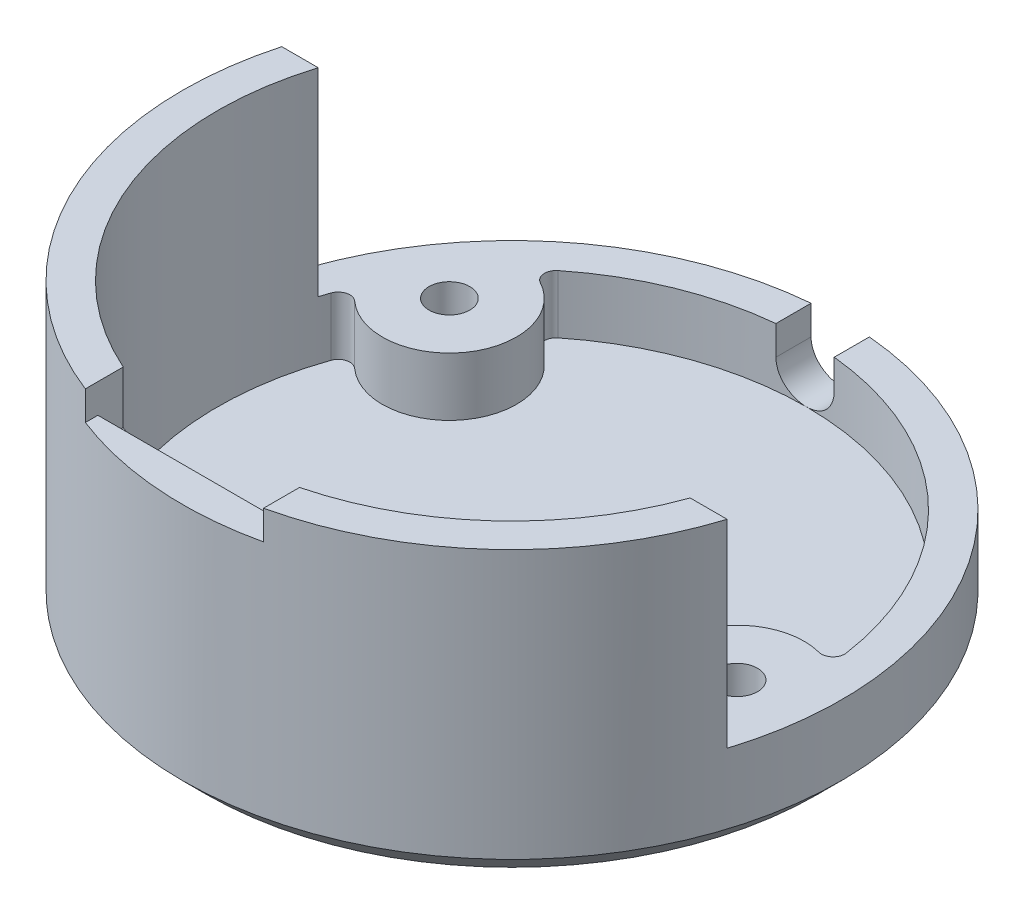
ISO-10303-21;
HEADER;
FILE_DESCRIPTION(('STEP AP214'),'2;1');
FILE_NAME('part.step','',(''),(''),'','','');
FILE_SCHEMA(('AUTOMOTIVE_DESIGN { 1 0 10303 214 1 1 1 1 }'));
ENDSEC;
DATA;
#1=APPLICATION_CONTEXT('core data for automotive mechanical design processes');
#2=APPLICATION_PROTOCOL_DEFINITION('international standard','automotive_design',2000,#1);
#3=PRODUCT_CONTEXT('',#1,'mechanical');
#4=PRODUCT('Part','Part','',(#3));
#5=PRODUCT_RELATED_PRODUCT_CATEGORY('part','',(#4));
#6=PRODUCT_DEFINITION_FORMATION('','',#4);
#7=PRODUCT_DEFINITION_CONTEXT('part definition',#1,'design');
#8=PRODUCT_DEFINITION('design','',#6,#7);
#9=PRODUCT_DEFINITION_SHAPE('','',#8);
#10=(LENGTH_UNIT() NAMED_UNIT(*) SI_UNIT(.MILLI.,.METRE.));
#11=(NAMED_UNIT(*) PLANE_ANGLE_UNIT() SI_UNIT($,.RADIAN.));
#12=(NAMED_UNIT(*) SI_UNIT($,.STERADIAN.) SOLID_ANGLE_UNIT());
#13=UNCERTAINTY_MEASURE_WITH_UNIT(LENGTH_MEASURE(1.E-05),#10,'distance_accuracy_value','');
#14=(GEOMETRIC_REPRESENTATION_CONTEXT(3) GLOBAL_UNCERTAINTY_ASSIGNED_CONTEXT((#13)) GLOBAL_UNIT_ASSIGNED_CONTEXT((#10,
#11,#12)) REPRESENTATION_CONTEXT('',''));
#15=CARTESIAN_POINT('',(0.,0.,0.));
#16=DIRECTION('',(0.,0.,1.));
#17=DIRECTION('',(1.,0.,0.));
#18=AXIS2_PLACEMENT_3D('',#15,#16,#17);
#19=CARTESIAN_POINT('',(0.,25.,0.));
#20=DIRECTION('',(0.,-1.,0.));
#21=DIRECTION('',(0.,0.,-1.));
#22=AXIS2_PLACEMENT_3D('',#19,#20,#21);
#23=CYLINDRICAL_SURFACE('',#22,25.25);
#24=CARTESIAN_POINT('',(0.,3.,0.));
#25=DIRECTION('',(0.,1.,0.));
#26=DIRECTION('',(0.,0.,1.));
#27=AXIS2_PLACEMENT_3D('',#24,#25,#26);
#28=CIRCLE('',#27,25.25);
#29=CARTESIAN_POINT('',(24.9803549939332,3.,-3.68026688938102));
#30=VERTEX_POINT('',#29);
#31=CARTESIAN_POINT('',(0.,3.,-25.25));
#32=VERTEX_POINT('',#31);
#33=EDGE_CURVE('E438',#30,#32,#28,.T.);
#34=ORIENTED_EDGE('',*,*,#33,.F.);
#35=DIRECTION('',(0.,-1.,0.));
#36=VECTOR('',#35,1.);
#37=CARTESIAN_POINT('',(24.9803549939332,25.,-3.68026688938102));
#38=LINE('',#37,#36);
#39=CARTESIAN_POINT('',(24.9803549939332,8.,-3.68026688938102));
#40=VERTEX_POINT('',#39);
#41=EDGE_CURVE('E375',#30,#40,#38,.F.);
#42=ORIENTED_EDGE('',*,*,#41,.T.);
#43=CARTESIAN_POINT('',(0.,8.,0.));
#44=DIRECTION('',(0.,-1.,0.));
#45=DIRECTION('',(0.,0.,-1.));
#46=AXIS2_PLACEMENT_3D('',#43,#44,#45);
#47=CIRCLE('',#46,25.25);
#48=CARTESIAN_POINT('',(2.5,8.,-25.1259328185045));
#49=VERTEX_POINT('',#48);
#50=EDGE_CURVE('E368',#49,#40,#47,.T.);
#51=ORIENTED_EDGE('',*,*,#50,.F.);
#52=DIRECTION('',(0.,-1.,0.));
#53=VECTOR('',#52,1.);
#54=CARTESIAN_POINT('',(2.49999999999999,25.,-25.1259328185045));
#55=LINE('',#54,#53);
#56=CARTESIAN_POINT('',(2.5,5.50000000000001,-25.1259328185045));
#57=VERTEX_POINT('',#56);
#58=EDGE_CURVE('E261',#57,#49,#55,.F.);
#59=ORIENTED_EDGE('',*,*,#58,.F.);
#60=CARTESIAN_POINT('',(0.,3.,-25.25));
#61=CARTESIAN_POINT('',(0.0701343196591282,2.99999306358478,-25.2500028305778));
#62=CARTESIAN_POINT('',(0.140265216695683,3.00295125432429,-25.2497078523953));
#63=CARTESIAN_POINT('',(0.28002189584099,3.01474418410962,-25.2485431940326));
#64=CARTESIAN_POINT('',(0.349647710913022,3.02357853610596,-25.2476735517042));
#65=CARTESIAN_POINT('',(0.487839193340102,3.0470588590707,-25.2453815722682));
#66=CARTESIAN_POINT('',(0.55640581115655,3.06169926232422,-25.2439597646865));
#67=CARTESIAN_POINT('',(0.692039109357974,3.09667030151849,-25.2406060478505));
#68=CARTESIAN_POINT('',(0.75910580235763,3.11700088958415,-25.238674142888));
#69=CARTESIAN_POINT('',(0.957399344983616,3.18635483372977,-25.232187775016));
#70=CARTESIAN_POINT('',(1.08578800052794,3.24375205073939,-25.2269414475106));
#71=CARTESIAN_POINT('',(1.33102535137235,3.37914694330917,-25.2151938494993));
#72=CARTESIAN_POINT('',(1.44787520992667,3.45714253937766,-25.2086927056903));
#73=CARTESIAN_POINT('',(1.66722062865698,3.63182460171821,-25.1951382803473));
#74=CARTESIAN_POINT('',(1.76967184646884,3.72856671434156,-25.1880833931481));
#75=CARTESIAN_POINT('',(1.95692252113277,3.9378924623258,-25.1742288495955));
#76=CARTESIAN_POINT('',(2.04171855501907,4.05047916253822,-25.1674292429445));
#77=CARTESIAN_POINT('',(2.19141651110233,4.28858723406225,-25.1548378724426));
#78=CARTESIAN_POINT('',(2.25627221690991,4.41413776648851,-25.1490484631821));
#79=CARTESIAN_POINT('',(2.36392987898948,4.6743882934218,-25.1391582315141));
#80=CARTESIAN_POINT('',(2.40674536949778,4.80908261533953,-25.1350563731436));
#81=CARTESIAN_POINT('',(2.45854901571322,5.0371565517034,-25.1300311487282));
#82=CARTESIAN_POINT('',(2.47408162673295,5.129089698999,-25.1285018799704));
#83=CARTESIAN_POINT('',(2.49480688701037,5.3140019424494,-25.1264495889556));
#84=CARTESIAN_POINT('',(2.50001315030004,5.406979498725,-25.1259252418626));
#85=CARTESIAN_POINT('',(2.5,5.50000000000001,-25.1259328185045));
#86=B_SPLINE_CURVE_WITH_KNOTS('',3,(#60,#61,#62,#63,#64,#65,#66,#67,#68,#69,#70,#71,#72,#73,#74,
#75,#76,#77,#78,#79,#80,#81,#82,#83,#84,#85),.UNSPECIFIED.,.F.,.F.,(4,2,2,2,2,2,2,2,2,2,2,2,4),
(0.,0.210333857785383,0.420653862726252,0.630772667034372,0.84088970353442,1.26091836444184,
1.68090463791503,2.10215722475029,2.52349140763364,2.94579489513256,3.36783874842554,
3.64703838499197,3.92586968552176),.UNSPECIFIED.);
#87=EDGE_CURVE('E275',#32,#57,#86,.T.);
#88=ORIENTED_EDGE('',*,*,#87,.F.);
#89=EDGE_LOOP('',(#34,#42,#51,#59,#88));
#90=FACE_BOUND('',#89,.T.);
#91=ADVANCED_FACE('F35',(#90),#23,.F.);
#92=DIRECTION('',(0.,1.,0.));
#93=VECTOR('',#92,1.);
#94=CARTESIAN_POINT('',(-10.25,22.5,23.0759615184286));
#95=LINE('',#94,#93);
#96=CARTESIAN_POINT('',(-10.25,20.5,23.0759615184286));
#97=VERTEX_POINT('',#96);
#98=CARTESIAN_POINT('',(-10.25,25.,23.0759615184286));
#99=VERTEX_POINT('',#98);
#100=EDGE_CURVE('E399',#97,#99,#95,.T.);
#101=ORIENTED_EDGE('',*,*,#100,.F.);
#102=CARTESIAN_POINT('',(0.,20.5,0.));
#103=DIRECTION('',(0.,1.,0.));
#104=DIRECTION('',(0.,0.,1.));
#105=AXIS2_PLACEMENT_3D('',#102,#103,#104);
#106=CIRCLE('',#105,25.25);
#107=CARTESIAN_POINT('',(0.,20.5,25.25));
#108=VERTEX_POINT('',#107);
#109=EDGE_CURVE('E39',#97,#108,#106,.T.);
#110=ORIENTED_EDGE('',*,*,#109,.T.);
#111=CARTESIAN_POINT('',(6.25,20.5,24.4642596454501));
#112=VERTEX_POINT('',#111);
#113=EDGE_CURVE('E11',#108,#112,#106,.T.);
#114=ORIENTED_EDGE('',*,*,#113,.T.);
#115=DIRECTION('',(0.,-1.,0.));
#116=VECTOR('',#115,1.);
#117=CARTESIAN_POINT('',(6.25,25.,24.4642596454501));
#118=LINE('',#117,#116);
#119=CARTESIAN_POINT('',(6.25,25.,24.4642596454501));
#120=VERTEX_POINT('',#119);
#121=EDGE_CURVE('E454',#120,#112,#118,.T.);
#122=ORIENTED_EDGE('',*,*,#121,.F.);
#123=CARTESIAN_POINT('',(0.,25.,0.));
#124=DIRECTION('',(0.,1.,0.));
#125=DIRECTION('',(0.,0.,1.));
#126=AXIS2_PLACEMENT_3D('',#123,#124,#125);
#127=CIRCLE('',#126,25.25);
#128=CARTESIAN_POINT('',(23.776301226221,25.,8.5));
#129=VERTEX_POINT('',#128);
#130=EDGE_CURVE('E441',#120,#129,#127,.T.);
#131=ORIENTED_EDGE('',*,*,#130,.T.);
#132=DIRECTION('',(0.,-1.,0.));
#133=VECTOR('',#132,1.);
#134=CARTESIAN_POINT('',(23.776301226221,25.,8.5));
#135=LINE('',#134,#133);
#136=CARTESIAN_POINT('',(23.776301226221,8.,8.5));
#137=VERTEX_POINT('',#136);
#138=EDGE_CURVE('E451',#137,#129,#135,.F.);
#139=ORIENTED_EDGE('',*,*,#138,.F.);
#140=CARTESIAN_POINT('',(0.,8.,0.));
#141=DIRECTION('',(0.,-1.,0.));
#142=DIRECTION('',(0.,0.,-1.));
#143=AXIS2_PLACEMENT_3D('',#140,#141,#142);
#144=CIRCLE('',#143,25.25);
#145=CARTESIAN_POINT('',(23.1195228059531,8.,10.1513627274872));
#146=VERTEX_POINT('',#145);
#147=EDGE_CURVE('E231',#137,#146,#144,.T.);
#148=ORIENTED_EDGE('',*,*,#147,.T.);
#149=DIRECTION('',(0.,-1.,0.));
#150=VECTOR('',#149,1.);
#151=CARTESIAN_POINT('',(23.1195228059531,25.,10.1513627274872));
#152=LINE('',#151,#150);
#153=CARTESIAN_POINT('',(23.1195228059531,3.,10.1513627274872));
#154=VERTEX_POINT('',#153);
#155=EDGE_CURVE('E470',#146,#154,#152,.T.);
#156=ORIENTED_EDGE('',*,*,#155,.T.);
#157=CARTESIAN_POINT('',(-23.838066942802,3.,-8.32520656983911));
#158=VERTEX_POINT('',#157);
#159=EDGE_CURVE('E442',#158,#154,#28,.T.);
#160=ORIENTED_EDGE('',*,*,#159,.F.);
#161=DIRECTION('',(0.,-1.,0.));
#162=VECTOR('',#161,1.);
#163=CARTESIAN_POINT('',(-23.838066942802,25.,-8.32520656983911));
#164=LINE('',#163,#162);
#165=CARTESIAN_POINT('',(-23.838066942802,8.,-8.32520656983911));
#166=VERTEX_POINT('',#165);
#167=EDGE_CURVE('E467',#158,#166,#164,.F.);
#168=ORIENTED_EDGE('',*,*,#167,.T.);
#169=CARTESIAN_POINT('',(-24.1104230572589,8.,-7.5));
#170=VERTEX_POINT('',#169);
#171=EDGE_CURVE('E367',#170,#166,#47,.T.);
#172=ORIENTED_EDGE('',*,*,#171,.F.);
#173=DIRECTION('',(0.,-1.,0.));
#174=VECTOR('',#173,1.);
#175=CARTESIAN_POINT('',(-24.1104230572589,25.,-7.5));
#176=LINE('',#175,#174);
#177=CARTESIAN_POINT('',(-24.1104230572589,25.,-7.5));
#178=VERTEX_POINT('',#177);
#179=EDGE_CURVE('E448',#178,#170,#176,.T.);
#180=ORIENTED_EDGE('',*,*,#179,.F.);
#181=EDGE_CURVE('E402',#178,#99,#127,.T.);
#182=ORIENTED_EDGE('',*,*,#181,.T.);
#183=EDGE_LOOP('',(#101,#110,#114,#122,#131,#139,#148,#156,#160,#168,#172,#180,#182));
#184=FACE_BOUND('',#183,.T.);
#185=ADVANCED_FACE('F339',(#184),#23,.F.);
#186=CARTESIAN_POINT('',(-15.7744607948879,8.,-19.7162087286208));
#187=VERTEX_POINT('',#186);
#188=CARTESIAN_POINT('',(-2.5,8.,-25.1259328185045));
#189=VERTEX_POINT('',#188);
#190=EDGE_CURVE('E359',#187,#189,#47,.T.);
#191=ORIENTED_EDGE('',*,*,#190,.F.);
#192=DIRECTION('',(0.,-1.,0.));
#193=VECTOR('',#192,1.);
#194=CARTESIAN_POINT('',(-15.7744607948879,25.,-19.7162087286209));
#195=LINE('',#194,#193);
#196=CARTESIAN_POINT('',(-15.7744607948879,3.,-19.7162087286208));
#197=VERTEX_POINT('',#196);
#198=EDGE_CURVE('E362',#187,#197,#195,.T.);
#199=ORIENTED_EDGE('',*,*,#198,.T.);
#200=EDGE_CURVE('E439',#32,#197,#28,.T.);
#201=ORIENTED_EDGE('',*,*,#200,.F.);
#202=CARTESIAN_POINT('',(-2.5,5.50000000000001,-25.1259328185045));
#203=CARTESIAN_POINT('',(-2.500006938468,5.42986653421026,-25.1259299323597));
#204=CARTESIAN_POINT('',(-2.4970488177389,5.35973649578316,-25.1262264005817));
#205=CARTESIAN_POINT('',(-2.48525618164105,5.21998158178091,-25.1273967215484));
#206=CARTESIAN_POINT('',(-2.47642205515371,5.15035667308388,-25.1282705360836));
#207=CARTESIAN_POINT('',(-2.4529423762165,5.01216717363184,-25.1305731266628));
#208=CARTESIAN_POINT('',(-2.43830240219161,4.94360163051897,-25.1320013699681));
#209=CARTESIAN_POINT('',(-2.40333242913165,4.80797049411069,-25.1353694799374));
#210=CARTESIAN_POINT('',(-2.38300247753148,4.74090488831598,-25.1373093423362));
#211=CARTESIAN_POINT('',(-2.31365084439657,4.54261477023227,-25.1438205308779));
#212=CARTESIAN_POINT('',(-2.2562556689679,4.41422841205633,-25.1490846804533));
#213=CARTESIAN_POINT('',(-2.12086554390219,4.16899483324265,-25.160862744428));
#214=CARTESIAN_POINT('',(-2.04287265501975,4.05214645986148,-25.1673765337859));
#215=CARTESIAN_POINT('',(-1.86819330921961,3.83279926558977,-25.1809458114164));
#216=CARTESIAN_POINT('',(-1.77145059949086,3.73034526719056,-25.1880028902555));
#217=CARTESIAN_POINT('',(-1.56212252140025,3.54308925651299,-25.2018501581695));
#218=CARTESIAN_POINT('',(-1.44953410001798,3.4582906537547,-25.208640295489));
#219=CARTESIAN_POINT('',(-1.21142455405267,3.30859002727512,-25.2212050250508));
#220=CARTESIAN_POINT('',(-1.08587456823887,3.24373374315931,-25.2269772699273));
#221=CARTESIAN_POINT('',(-0.8256251663262,3.13607483274152,-25.2368332171791));
#222=CARTESIAN_POINT('',(-0.690931414899495,3.09325869091226,-25.2409179540692));
#223=CARTESIAN_POINT('',(-0.462855672552283,3.04145318207209,-25.2459210955878));
#224=CARTESIAN_POINT('',(-0.370919998305977,3.02591972907533,-25.2474432398742));
#225=CARTESIAN_POINT('',(-0.186002830708624,3.00519337903663,-25.2494857434618));
#226=CARTESIAN_POINT('',(-0.0930228787671035,2.99998685361483,-25.2500074230396));
#227=CARTESIAN_POINT('',(0.,3.,-25.25));
#228=B_SPLINE_CURVE_WITH_KNOTS('',3,(#202,#203,#204,#205,#206,#207,#208,#209,#210,#211,#212,
#213,#214,#215,#216,#217,#218,#219,#220,#221,#222,#223,#224,#225,#226,#227),.UNSPECIFIED.,.F.,
.F.,(4,2,2,2,2,2,2,2,2,2,2,2,4),(0.,0.210331284577824,0.420648650553219,0.630764425273714,
0.840878448401325,1.26090047238821,1.68088049003108,2.10214059278194,2.52348197183612,
2.94578265042625,3.36782405500383,3.64703123459165,3.92586970044969),.UNSPECIFIED.);
#229=CARTESIAN_POINT('',(-2.5,5.50000000000001,-25.1259328185045));
#230=VERTEX_POINT('',#229);
#231=EDGE_CURVE('E266',#230,#32,#228,.T.);
#232=ORIENTED_EDGE('',*,*,#231,.F.);
#233=DIRECTION('',(0.,-1.,0.));
#234=VECTOR('',#233,1.);
#235=CARTESIAN_POINT('',(-2.49999999999999,25.,-25.1259328185045));
#236=LINE('',#235,#234);
#237=EDGE_CURVE('E254',#189,#230,#236,.T.);
#238=ORIENTED_EDGE('',*,*,#237,.F.);
#239=EDGE_LOOP('',(#191,#199,#201,#232,#238));
#240=FACE_BOUND('',#239,.T.);
#241=ADVANCED_FACE('F281',(#240),#23,.F.);
#242=CARTESIAN_POINT('',(0.,8.,0.));
#243=DIRECTION('',(0.,-1.,0.));
#244=DIRECTION('',(0.,0.,-1.));
#245=AXIS2_PLACEMENT_3D('',#242,#243,#244);
#246=PLANE('',#245);
#247=ORIENTED_EDGE('',*,*,#50,.T.);
#248=CARTESIAN_POINT('',(23.9910340040745,8.,-3.53451374524712));
#249=DIRECTION('',(0.,-1.,0.));
#250=DIRECTION('',(0.,0.,-1.));
#251=AXIS2_PLACEMENT_3D('',#248,#249,#250);
#252=CIRCLE('',#251,1.);
#253=CARTESIAN_POINT('',(23.7403775769491,8.,-2.56643763484013));
#254=VERTEX_POINT('',#253);
#255=EDGE_CURVE('E388',#40,#254,#252,.T.);
#256=ORIENTED_EDGE('',*,*,#255,.T.);
#257=CARTESIAN_POINT('',(22.2991031209778,8.,3.));
#258=DIRECTION('',(0.,-1.,0.));
#259=DIRECTION('',(0.,0.,-1.));
#260=AXIS2_PLACEMENT_3D('',#257,#258,#259);
#261=CIRCLE('',#260,5.75);
#262=CARTESIAN_POINT('',(22.2180025819422,8.,8.74942803264534));
#263=VERTEX_POINT('',#262);
#264=EDGE_CURVE('E224',#263,#254,#261,.T.);
#265=ORIENTED_EDGE('',*,*,#264,.F.);
#266=CARTESIAN_POINT('',(22.2038981403708,8.,9.74932856006193));
#267=DIRECTION('',(0.,-1.,0.));
#268=DIRECTION('',(0.,0.,-1.));
#269=AXIS2_PLACEMENT_3D('',#266,#267,#268);
#270=CIRCLE('',#269,1.);
#271=EDGE_CURVE('E385',#263,#146,#270,.T.);
#272=ORIENTED_EDGE('',*,*,#271,.T.);
#273=ORIENTED_EDGE('',*,*,#147,.F.);
#274=DIRECTION('',(1.,0.,0.));
#275=VECTOR('',#274,1.);
#276=CARTESIAN_POINT('',(28.25,8.,8.5));
#277=LINE('',#276,#275);
#278=CARTESIAN_POINT('',(26.9409075570961,8.,8.5));
#279=VERTEX_POINT('',#278);
#280=EDGE_CURVE('E422',#137,#279,#277,.T.);
#281=ORIENTED_EDGE('',*,*,#280,.T.);
#282=CARTESIAN_POINT('',(0.,8.,0.));
#283=DIRECTION('',(0.,-1.,0.));
#284=DIRECTION('',(0.,0.,-1.));
#285=AXIS2_PLACEMENT_3D('',#282,#283,#284);
#286=CIRCLE('',#285,28.25);
#287=CARTESIAN_POINT('',(2.5,8.,-28.1391631005615));
#288=VERTEX_POINT('',#287);
#289=EDGE_CURVE('E426',#288,#279,#286,.T.);
#290=ORIENTED_EDGE('',*,*,#289,.F.);
#291=DIRECTION('',(0.,0.,1.));
#292=VECTOR('',#291,1.);
#293=CARTESIAN_POINT('',(2.5,8.,0.));
#294=LINE('',#293,#292);
#295=EDGE_CURVE('E458',#288,#49,#294,.T.);
#296=ORIENTED_EDGE('',*,*,#295,.T.);
#297=EDGE_LOOP('',(#247,#256,#265,#272,#273,#281,#290,#296));
#298=FACE_BOUND('',#297,.T.);
#299=CARTESIAN_POINT('',(22.2991031209778,8.,3.));
#300=DIRECTION('',(0.,-1.,0.));
#301=DIRECTION('',(0.,0.,-1.));
#302=AXIS2_PLACEMENT_3D('',#299,#300,#301);
#303=CIRCLE('',#302,1.75);
#304=CARTESIAN_POINT('',(22.2991031209778,8.,1.25));
#305=VERTEX_POINT('',#304);
#306=EDGE_CURVE('E223',#305,#305,#303,.T.);
#307=ORIENTED_EDGE('',*,*,#306,.T.);
#308=EDGE_LOOP('',(#307));
#309=FACE_BOUND('',#308,.T.);
#310=ADVANCED_FACE('F348',(#298,#309),#246,.F.);
#311=CARTESIAN_POINT('',(0.,25.,0.));
#312=DIRECTION('',(0.,1.,0.));
#313=DIRECTION('',(0.,0.,1.));
#314=AXIS2_PLACEMENT_3D('',#311,#312,#313);
#315=PLANE('',#314);
#316=DIRECTION('',(0.,0.,1.));
#317=VECTOR('',#316,1.);
#318=CARTESIAN_POINT('',(-10.25,25.,28.25));
#319=LINE('',#318,#317);
#320=CARTESIAN_POINT('',(-10.25,25.,26.3248931621764));
#321=VERTEX_POINT('',#320);
#322=EDGE_CURVE('E305',#99,#321,#319,.T.);
#323=ORIENTED_EDGE('',*,*,#322,.F.);
#324=ORIENTED_EDGE('',*,*,#181,.F.);
#325=DIRECTION('',(1.,0.,0.));
#326=VECTOR('',#325,1.);
#327=CARTESIAN_POINT('',(0.,25.,-7.5));
#328=LINE('',#327,#326);
#329=CARTESIAN_POINT('',(-27.2362350555285,25.,-7.5));
#330=VERTEX_POINT('',#329);
#331=EDGE_CURVE('E419',#330,#178,#328,.T.);
#332=ORIENTED_EDGE('',*,*,#331,.F.);
#333=CARTESIAN_POINT('',(0.,25.,0.));
#334=DIRECTION('',(0.,1.,0.));
#335=DIRECTION('',(0.,0.,1.));
#336=AXIS2_PLACEMENT_3D('',#333,#334,#335);
#337=CIRCLE('',#336,28.25);
#338=EDGE_CURVE('E445',#330,#321,#337,.T.);
#339=ORIENTED_EDGE('',*,*,#338,.T.);
#340=EDGE_LOOP('',(#323,#324,#332,#339));
#341=FACE_BOUND('',#340,.T.);
#342=ADVANCED_FACE('F313',(#341),#315,.T.);
#343=CARTESIAN_POINT('',(0.,25.,0.));
#344=DIRECTION('',(0.,-1.,0.));
#345=DIRECTION('',(0.,0.,-1.));
#346=AXIS2_PLACEMENT_3D('',#343,#344,#345);
#347=CYLINDRICAL_SURFACE('',#346,28.25);
#348=CARTESIAN_POINT('',(0.,2.00000000000001,0.));
#349=DIRECTION('',(0.,1.,0.));
#350=DIRECTION('',(0.,0.,1.));
#351=AXIS2_PLACEMENT_3D('',#348,#349,#350);
#352=CIRCLE('',#351,28.25);
#353=CARTESIAN_POINT('',(0.,2.00000000000001,28.25));
#354=VERTEX_POINT('',#353);
#355=EDGE_CURVE('E392',#354,#354,#352,.T.);
#356=ORIENTED_EDGE('',*,*,#355,.T.);
#357=EDGE_LOOP('',(#356));
#358=FACE_BOUND('',#357,.T.);
#359=DIRECTION('',(0.,-1.,0.));
#360=VECTOR('',#359,1.);
#361=CARTESIAN_POINT('',(-2.49999999999999,25.,-28.1391631005615));
#362=LINE('',#361,#360);
#363=CARTESIAN_POINT('',(-2.5,8.,-28.1391631005615));
#364=VERTEX_POINT('',#363);
#365=CARTESIAN_POINT('',(-2.5,5.50000000000001,-28.1391631005615));
#366=VERTEX_POINT('',#365);
#367=EDGE_CURVE('E258',#364,#366,#362,.T.);
#368=ORIENTED_EDGE('',*,*,#367,.T.);
#369=CARTESIAN_POINT('',(-2.5,5.50000000000001,-28.1391631005615));
#370=CARTESIAN_POINT('',(-2.50000689646736,5.42983158110518,-28.1391605268283));
#371=CARTESIAN_POINT('',(-2.49704587192604,5.35966654391296,-28.1394255065767));
#372=CARTESIAN_POINT('',(-2.48524137720348,5.21984116334117,-28.1404715595615));
#373=CARTESIAN_POINT('',(-2.47639827411585,5.15018078874045,-28.1412526005912));
#374=CARTESIAN_POINT('',(-2.45289315868328,5.01191350397061,-28.1433108780643));
#375=CARTESIAN_POINT('',(-2.43823617740451,4.94330573610088,-28.1445876854739));
#376=CARTESIAN_POINT('',(-2.40322433236625,4.80759053233639,-28.1475988072722));
#377=CARTESIAN_POINT('',(-2.38286952025361,4.74048308284823,-28.1493331175141));
#378=CARTESIAN_POINT('',(-2.31343065689666,4.54206866329107,-28.1551546160368));
#379=CARTESIAN_POINT('',(-2.25596048312088,4.41360122201702,-28.1598614614813));
#380=CARTESIAN_POINT('',(-2.12038895426501,4.16822475735298,-28.1703929814974));
#381=CARTESIAN_POINT('',(-2.04229042388618,4.05131415446113,-28.1762175029926));
#382=CARTESIAN_POINT('',(-1.86742315108781,3.83193436072547,-28.1883470718142));
#383=CARTESIAN_POINT('',(-1.77060888408628,3.72950145949167,-28.1946532676788));
#384=CARTESIAN_POINT('',(-1.56114861456425,3.54230970783483,-28.2070257141034));
#385=CARTESIAN_POINT('',(-1.44850020583893,3.45755354849495,-28.2130919280151));
#386=CARTESIAN_POINT('',(-1.21035195004412,3.30800371872389,-28.2243114954236));
#387=CARTESIAN_POINT('',(-1.08483169484369,3.24324242268324,-28.2294633627956));
#388=CARTESIAN_POINT('',(-0.824653394847859,3.13573315708137,-28.2382607519674));
#389=CARTESIAN_POINT('',(-0.689996082701349,3.0929834248926,-28.2419063943769));
#390=CARTESIAN_POINT('',(-0.415733392258923,3.03081288112124,-28.2472727686186));
#391=CARTESIAN_POINT('',(-0.276141907560928,3.01133121946507,-28.2489985204855));
#392=CARTESIAN_POINT('',(0.00434295763610671,2.99606171299833,-28.2503477175985));
#393=CARTESIAN_POINT('',(0.145236343056956,3.0002739577987,-28.2499711548935));
#394=CARTESIAN_POINT('',(0.423905114124957,3.03222383756093,-28.2471622070468));
#395=CARTESIAN_POINT('',(0.561688146800701,3.05989535359237,-28.2447355999325));
#396=CARTESIAN_POINT('',(0.830645714380134,3.1378753287869,-28.2381060993052));
#397=CARTESIAN_POINT('',(0.961820211596336,3.18818391702957,-28.2339031956633));
#398=CARTESIAN_POINT('',(1.21405015200019,3.31008439379139,-28.2241838091613));
#399=CARTESIAN_POINT('',(1.33509105117874,3.38170622269389,-28.2186654806045));
#400=CARTESIAN_POINT('',(1.56345295311568,3.54417514192329,-28.2069354702832));
#401=CARTESIAN_POINT('',(1.67077426591069,3.63502179768234,-28.2007238041927));
#402=CARTESIAN_POINT('',(1.86902949889513,3.83371928673604,-28.188280350554));
#403=CARTESIAN_POINT('',(1.95990822078429,3.94162519764428,-28.1820485641906));
#404=CARTESIAN_POINT('',(2.12229830427058,4.17123263663078,-28.1702858142741));
#405=CARTESIAN_POINT('',(2.19380371956517,4.29293838410872,-28.1647550661691));
#406=CARTESIAN_POINT('',(2.31541333150734,4.5467464493002,-28.1550190954106));
#407=CARTESIAN_POINT('',(2.3655015913039,4.67885642270672,-28.1508148604443));
#408=CARTESIAN_POINT('',(2.44269466413333,4.94955729805081,-28.1442226534277));
#409=CARTESIAN_POINT('',(2.46983431139005,5.08813803919551,-28.1418319291776));
#410=CARTESIAN_POINT('',(2.49009701760833,5.2730652182575,-28.14004132007));
#411=CARTESIAN_POINT('',(2.49381250727948,5.3184121365793,-28.1397121869119));
#412=CARTESIAN_POINT('',(2.49876063638993,5.40916643996549,-28.1392733531504));
#413=CARTESIAN_POINT('',(2.49999740987091,5.45457359775016,-28.1391632871855));
#414=CARTESIAN_POINT('',(2.5,5.5,-28.1391631005615));
#415=B_SPLINE_CURVE_WITH_KNOTS('',3,(#369,#370,#371,#372,#373,#374,#375,#376,#377,#378,#379,
#380,#381,#382,#383,#384,#385,#386,#387,#388,#389,#390,#391,#392,#393,#394,#395,#396,#397,#398,
#399,#400,#401,#402,#403,#404,#405,#406,#407,#408,#409,#410,#411,#412,#413,#414),.UNSPECIFIED.,
.F.,.F.,(4,2,2,2,2,2,2,2,2,2,2,2,2,2,2,2,2,2,2,2,2,2,4),(0.,0.210436249085518,0.42085936632481,
0.631100788817249,0.841340305679465,1.26161375746812,1.68182968979055,2.10308092705159,
2.52439624829121,2.94639020131808,3.36835035693304,3.78920457967184,4.21006039409289,
4.62973397319004,5.04940994535191,5.46967827499107,5.88993710568391,6.31158159026024,
6.73335534510808,7.15544240472956,7.57688761270102,7.71333915213923,7.84956292554734),.UNSPECIFIED.);
#416=CARTESIAN_POINT('',(2.5,5.50000000000001,-28.1391631005615));
#417=VERTEX_POINT('',#416);
#418=EDGE_CURVE('E298',#366,#417,#415,.T.);
#419=ORIENTED_EDGE('',*,*,#418,.T.);
#420=DIRECTION('',(0.,-1.,0.));
#421=VECTOR('',#420,1.);
#422=CARTESIAN_POINT('',(2.49999999999999,25.,-28.1391631005615));
#423=LINE('',#422,#421);
#424=EDGE_CURVE('E263',#417,#288,#423,.F.);
#425=ORIENTED_EDGE('',*,*,#424,.T.);
#426=ORIENTED_EDGE('',*,*,#289,.T.);
#427=DIRECTION('',(0.,-1.,0.));
#428=VECTOR('',#427,1.);
#429=CARTESIAN_POINT('',(26.9409075570961,25.,8.5));
#430=LINE('',#429,#428);
#431=CARTESIAN_POINT('',(26.9409075570961,25.,8.5));
#432=VERTEX_POINT('',#431);
#433=EDGE_CURVE('E435',#279,#432,#430,.F.);
#434=ORIENTED_EDGE('',*,*,#433,.T.);
#435=CARTESIAN_POINT('',(6.25,25.,27.5499546279118));
#436=VERTEX_POINT('',#435);
#437=EDGE_CURVE('E444',#436,#432,#337,.T.);
#438=ORIENTED_EDGE('',*,*,#437,.F.);
#439=DIRECTION('',(0.,-1.,0.));
#440=VECTOR('',#439,1.);
#441=CARTESIAN_POINT('',(6.25,25.,27.5499546279118));
#442=LINE('',#441,#440);
#443=CARTESIAN_POINT('',(6.25,22.5,27.5499546279118));
#444=VERTEX_POINT('',#443);
#445=EDGE_CURVE('E408',#436,#444,#442,.T.);
#446=ORIENTED_EDGE('',*,*,#445,.T.);
#447=CARTESIAN_POINT('',(0.,22.5,0.));
#448=DIRECTION('',(0.,-1.,0.));
#449=DIRECTION('',(0.,0.,-1.));
#450=AXIS2_PLACEMENT_3D('',#447,#448,#449);
#451=CIRCLE('',#450,28.25);
#452=CARTESIAN_POINT('',(-10.25,22.5,26.3248931621764));
#453=VERTEX_POINT('',#452);
#454=EDGE_CURVE('E404',#444,#453,#451,.T.);
#455=ORIENTED_EDGE('',*,*,#454,.T.);
#456=DIRECTION('',(0.,-1.,0.));
#457=VECTOR('',#456,1.);
#458=CARTESIAN_POINT('',(-10.25,25.,26.3248931621764));
#459=LINE('',#458,#457);
#460=EDGE_CURVE('E416',#453,#321,#459,.F.);
#461=ORIENTED_EDGE('',*,*,#460,.T.);
#462=ORIENTED_EDGE('',*,*,#338,.F.);
#463=DIRECTION('',(0.,-1.,0.));
#464=VECTOR('',#463,1.);
#465=CARTESIAN_POINT('',(-27.2362350555285,25.,-7.5));
#466=LINE('',#465,#464);
#467=CARTESIAN_POINT('',(-27.2362350555285,8.,-7.5));
#468=VERTEX_POINT('',#467);
#469=EDGE_CURVE('E432',#330,#468,#466,.T.);
#470=ORIENTED_EDGE('',*,*,#469,.T.);
#471=EDGE_CURVE('E430',#468,#364,#286,.T.);
#472=ORIENTED_EDGE('',*,*,#471,.T.);
#473=EDGE_LOOP('',(#368,#419,#425,#426,#434,#438,#446,#455,#461,#462,#470,#472));
#474=FACE_BOUND('',#473,.T.);
#475=ADVANCED_FACE('F307',(#358,#474),#347,.T.);
#476=DIRECTION('',(0.,0.,-1.));
#477=VECTOR('',#476,1.);
#478=CARTESIAN_POINT('',(6.25,25.,28.25));
#479=LINE('',#478,#477);
#480=EDGE_CURVE('E411',#436,#120,#479,.T.);
#481=ORIENTED_EDGE('',*,*,#480,.F.);
#482=ORIENTED_EDGE('',*,*,#437,.T.);
#483=DIRECTION('',(1.,0.,0.));
#484=VECTOR('',#483,1.);
#485=CARTESIAN_POINT('',(28.25,25.,8.5));
#486=LINE('',#485,#484);
#487=EDGE_CURVE('E423',#129,#432,#486,.T.);
#488=ORIENTED_EDGE('',*,*,#487,.F.);
#489=ORIENTED_EDGE('',*,*,#130,.F.);
#490=EDGE_LOOP('',(#481,#482,#488,#489));
#491=FACE_BOUND('',#490,.T.);
#492=ADVANCED_FACE('F312',(#491),#315,.T.);
#493=CARTESIAN_POINT('',(0.,0.,0.));
#494=DIRECTION('',(0.,1.,0.));
#495=DIRECTION('',(0.,0.,1.));
#496=AXIS2_PLACEMENT_3D('',#493,#494,#495);
#497=PLANE('',#496);
#498=CARTESIAN_POINT('',(0.,0.,0.));
#499=DIRECTION('',(0.,1.,0.));
#500=DIRECTION('',(0.,0.,1.));
#501=AXIS2_PLACEMENT_3D('',#498,#499,#500);
#502=CIRCLE('',#501,26.25);
#503=CARTESIAN_POINT('',(0.,0.,26.25));
#504=VERTEX_POINT('',#503);
#505=EDGE_CURVE('E395',#504,#504,#502,.F.);
#506=ORIENTED_EDGE('',*,*,#505,.T.);
#507=EDGE_LOOP('',(#506));
#508=FACE_BOUND('',#507,.T.);
#509=CARTESIAN_POINT('',(-18.364367672207,0.,-13.));
#510=DIRECTION('',(0.,1.,0.));
#511=DIRECTION('',(0.,0.,1.));
#512=AXIS2_PLACEMENT_3D('',#509,#510,#511);
#513=CIRCLE('',#512,3.25);
#514=CARTESIAN_POINT('',(-18.364367672207,0.,-9.74999999999999));
#515=VERTEX_POINT('',#514);
#516=EDGE_CURVE('E245',#515,#515,#513,.T.);
#517=ORIENTED_EDGE('',*,*,#516,.T.);
#518=EDGE_LOOP('',(#517));
#519=FACE_BOUND('',#518,.T.);
#520=CARTESIAN_POINT('',(22.2991031209778,0.,3.));
#521=DIRECTION('',(0.,1.,0.));
#522=DIRECTION('',(0.,0.,1.));
#523=AXIS2_PLACEMENT_3D('',#520,#521,#522);
#524=CIRCLE('',#523,3.25);
#525=CARTESIAN_POINT('',(22.2991031209778,0.,6.25));
#526=VERTEX_POINT('',#525);
#527=EDGE_CURVE('E244',#526,#526,#524,.T.);
#528=ORIENTED_EDGE('',*,*,#527,.T.);
#529=EDGE_LOOP('',(#528));
#530=FACE_BOUND('',#529,.T.);
#531=ADVANCED_FACE('F315',(#508,#519,#530),#497,.F.);
#532=CARTESIAN_POINT('',(0.,3.,0.));
#533=DIRECTION('',(0.,1.,0.));
#534=DIRECTION('',(0.,0.,1.));
#535=AXIS2_PLACEMENT_3D('',#532,#533,#534);
#536=PLANE('',#535);
#537=ORIENTED_EDGE('',*,*,#159,.T.);
#538=CARTESIAN_POINT('',(22.2038981403708,3.,9.74932856006193));
#539=DIRECTION('',(0.,1.,0.));
#540=DIRECTION('',(0.,0.,1.));
#541=AXIS2_PLACEMENT_3D('',#538,#539,#540);
#542=CIRCLE('',#541,1.);
#543=CARTESIAN_POINT('',(22.2180025819422,3.,8.74942803264534));
#544=VERTEX_POINT('',#543);
#545=EDGE_CURVE('E478',#154,#544,#542,.T.);
#546=ORIENTED_EDGE('',*,*,#545,.T.);
#547=CARTESIAN_POINT('',(22.2991031209778,3.,3.));
#548=DIRECTION('',(0.,1.,0.));
#549=DIRECTION('',(0.,0.,1.));
#550=AXIS2_PLACEMENT_3D('',#547,#548,#549);
#551=CIRCLE('',#550,5.75);
#552=CARTESIAN_POINT('',(23.7403775769491,3.,-2.56643763484013));
#553=VERTEX_POINT('',#552);
#554=EDGE_CURVE('E220',#553,#544,#551,.T.);
#555=ORIENTED_EDGE('',*,*,#554,.F.);
#556=CARTESIAN_POINT('',(23.9910340040745,3.,-3.53451374524712));
#557=DIRECTION('',(0.,1.,0.));
#558=DIRECTION('',(0.,0.,1.));
#559=AXIS2_PLACEMENT_3D('',#556,#557,#558);
#560=CIRCLE('',#559,1.);
#561=EDGE_CURVE('E476',#553,#30,#560,.T.);
#562=ORIENTED_EDGE('',*,*,#561,.T.);
#563=ORIENTED_EDGE('',*,*,#33,.T.);
#564=ORIENTED_EDGE('',*,*,#200,.T.);
#565=CARTESIAN_POINT('',(-15.1497296742983,3.,-18.9353687789725));
#566=DIRECTION('',(0.,1.,0.));
#567=DIRECTION('',(0.,0.,1.));
#568=AXIS2_PLACEMENT_3D('',#565,#566,#567);
#569=CIRCLE('',#568,1.);
#570=CARTESIAN_POINT('',(-15.6259723406551,3.,-18.0560548857914));
#571=VERTEX_POINT('',#570);
#572=EDGE_CURVE('E373',#197,#571,#569,.T.);
#573=ORIENTED_EDGE('',*,*,#572,.T.);
#574=CARTESIAN_POINT('',(-18.364367672207,3.,-13.));
#575=DIRECTION('',(0.,1.,0.));
#576=DIRECTION('',(0.,0.,1.));
#577=AXIS2_PLACEMENT_3D('',#574,#575,#576);
#578=CIRCLE('',#577,5.75);
#579=CARTESIAN_POINT('',(-22.2229306523516,3.,-8.73690350469785));
#580=VERTEX_POINT('',#579);
#581=EDGE_CURVE('E234',#580,#571,#578,.T.);
#582=ORIENTED_EDGE('',*,*,#581,.F.);
#583=CARTESIAN_POINT('',(-22.8939850836811,3.,-7.99549541855835));
#584=DIRECTION('',(0.,1.,0.));
#585=DIRECTION('',(0.,0.,1.));
#586=AXIS2_PLACEMENT_3D('',#583,#584,#585);
#587=CIRCLE('',#586,1.);
#588=EDGE_CURVE('E473',#580,#158,#587,.T.);
#589=ORIENTED_EDGE('',*,*,#588,.T.);
#590=EDGE_LOOP('',(#537,#546,#555,#562,#563,#564,#573,#582,#589));
#591=FACE_BOUND('',#590,.T.);
#592=ADVANCED_FACE('F496',(#591),#536,.T.);
#593=CARTESIAN_POINT('',(28.25,8.,8.5));
#594=DIRECTION('',(0.,0.,1.));
#595=DIRECTION('',(1.,0.,0.));
#596=AXIS2_PLACEMENT_3D('',#593,#594,#595);
#597=PLANE('',#596);
#598=ORIENTED_EDGE('',*,*,#280,.F.);
#599=ORIENTED_EDGE('',*,*,#138,.T.);
#600=ORIENTED_EDGE('',*,*,#487,.T.);
#601=ORIENTED_EDGE('',*,*,#433,.F.);
#602=EDGE_LOOP('',(#598,#599,#600,#601));
#603=FACE_BOUND('',#602,.T.);
#604=ADVANCED_FACE('F586',(#603),#597,.F.);
#605=CARTESIAN_POINT('',(0.,8.,-7.5));
#606=DIRECTION('',(0.,0.,1.));
#607=DIRECTION('',(1.,0.,0.));
#608=AXIS2_PLACEMENT_3D('',#605,#606,#607);
#609=PLANE('',#608);
#610=ORIENTED_EDGE('',*,*,#331,.T.);
#611=ORIENTED_EDGE('',*,*,#179,.T.);
#612=DIRECTION('',(1.,0.,0.));
#613=VECTOR('',#612,1.);
#614=CARTESIAN_POINT('',(0.,8.,-7.5));
#615=LINE('',#614,#613);
#616=EDGE_CURVE('E420',#468,#170,#615,.T.);
#617=ORIENTED_EDGE('',*,*,#616,.F.);
#618=ORIENTED_EDGE('',*,*,#469,.F.);
#619=EDGE_LOOP('',(#610,#611,#617,#618));
#620=FACE_BOUND('',#619,.T.);
#621=ADVANCED_FACE('F518',(#620),#609,.F.);
#622=DIRECTION('',(0.,0.,-1.));
#623=VECTOR('',#622,1.);
#624=CARTESIAN_POINT('',(-2.5,8.,0.));
#625=LINE('',#624,#623);
#626=EDGE_CURVE('E456',#189,#364,#625,.T.);
#627=ORIENTED_EDGE('',*,*,#626,.T.);
#628=ORIENTED_EDGE('',*,*,#471,.F.);
#629=ORIENTED_EDGE('',*,*,#616,.T.);
#630=ORIENTED_EDGE('',*,*,#171,.T.);
#631=CARTESIAN_POINT('',(-22.8939850836811,8.,-7.99549541855835));
#632=DIRECTION('',(0.,-1.,0.));
#633=DIRECTION('',(0.,0.,-1.));
#634=AXIS2_PLACEMENT_3D('',#631,#632,#633);
#635=CIRCLE('',#634,1.);
#636=CARTESIAN_POINT('',(-22.2229306523516,8.,-8.73690350469785));
#637=VERTEX_POINT('',#636);
#638=EDGE_CURVE('E58',#166,#637,#635,.T.);
#639=ORIENTED_EDGE('',*,*,#638,.T.);
#640=CARTESIAN_POINT('',(-18.364367672207,8.,-13.));
#641=DIRECTION('',(0.,-1.,0.));
#642=DIRECTION('',(0.,0.,-1.));
#643=AXIS2_PLACEMENT_3D('',#640,#641,#642);
#644=CIRCLE('',#643,5.75);
#645=CARTESIAN_POINT('',(-15.6259723406551,8.,-18.0560548857914));
#646=VERTEX_POINT('',#645);
#647=EDGE_CURVE('E238',#646,#637,#644,.T.);
#648=ORIENTED_EDGE('',*,*,#647,.F.);
#649=CARTESIAN_POINT('',(-15.1497296742983,8.,-18.9353687789725));
#650=DIRECTION('',(0.,-1.,0.));
#651=DIRECTION('',(0.,0.,-1.));
#652=AXIS2_PLACEMENT_3D('',#649,#650,#651);
#653=CIRCLE('',#652,1.);
#654=EDGE_CURVE('E372',#646,#187,#653,.T.);
#655=ORIENTED_EDGE('',*,*,#654,.T.);
#656=ORIENTED_EDGE('',*,*,#190,.T.);
#657=EDGE_LOOP('',(#627,#628,#629,#630,#639,#648,#655,#656));
#658=FACE_BOUND('',#657,.T.);
#659=CARTESIAN_POINT('',(-18.364367672207,8.,-13.));
#660=DIRECTION('',(0.,-1.,0.));
#661=DIRECTION('',(0.,0.,-1.));
#662=AXIS2_PLACEMENT_3D('',#659,#660,#661);
#663=CIRCLE('',#662,1.75);
#664=CARTESIAN_POINT('',(-18.364367672207,8.,-14.75));
#665=VERTEX_POINT('',#664);
#666=EDGE_CURVE('E237',#665,#665,#663,.T.);
#667=ORIENTED_EDGE('',*,*,#666,.T.);
#668=EDGE_LOOP('',(#667));
#669=FACE_BOUND('',#668,.T.);
#670=ADVANCED_FACE('F355',(#658,#669),#246,.F.);
#671=CARTESIAN_POINT('',(-10.25,22.5,28.25));
#672=DIRECTION('',(-1.,0.,0.));
#673=DIRECTION('',(0.,0.,1.));
#674=AXIS2_PLACEMENT_3D('',#671,#672,#673);
#675=PLANE('',#674);
#676=DIRECTION('',(0.,0.,1.));
#677=VECTOR('',#676,1.);
#678=CARTESIAN_POINT('',(-10.25,22.5,28.25));
#679=LINE('',#678,#677);
#680=CARTESIAN_POINT('',(-10.25,22.5,25.25));
#681=VERTEX_POINT('',#680);
#682=EDGE_CURVE('E197',#681,#453,#679,.T.);
#683=ORIENTED_EDGE('',*,*,#682,.F.);
#684=DIRECTION('',(0.,1.,0.));
#685=VECTOR('',#684,1.);
#686=CARTESIAN_POINT('',(-10.25,20.5,25.25));
#687=LINE('',#686,#685);
#688=CARTESIAN_POINT('',(-10.25,20.5,25.25));
#689=VERTEX_POINT('',#688);
#690=EDGE_CURVE('E191',#689,#681,#687,.T.);
#691=ORIENTED_EDGE('',*,*,#690,.F.);
#692=DIRECTION('',(0.,0.,1.));
#693=VECTOR('',#692,1.);
#694=CARTESIAN_POINT('',(-10.25,20.5,23.0759615184286));
#695=LINE('',#694,#693);
#696=EDGE_CURVE('E195',#97,#689,#695,.T.);
#697=ORIENTED_EDGE('',*,*,#696,.F.);
#698=ORIENTED_EDGE('',*,*,#100,.T.);
#699=ORIENTED_EDGE('',*,*,#322,.T.);
#700=ORIENTED_EDGE('',*,*,#460,.F.);
#701=EDGE_LOOP('',(#683,#691,#697,#698,#699,#700));
#702=FACE_BOUND('',#701,.T.);
#703=ADVANCED_FACE('F193',(#702),#675,.F.);
#704=CARTESIAN_POINT('',(6.25,22.5,28.25));
#705=DIRECTION('',(1.,0.,0.));
#706=DIRECTION('',(0.,0.,-1.));
#707=AXIS2_PLACEMENT_3D('',#704,#705,#706);
#708=PLANE('',#707);
#709=ORIENTED_EDGE('',*,*,#480,.T.);
#710=ORIENTED_EDGE('',*,*,#121,.T.);
#711=DIRECTION('',(0.,0.,-1.));
#712=VECTOR('',#711,1.);
#713=CARTESIAN_POINT('',(6.25,20.5,23.0759615184286));
#714=LINE('',#713,#712);
#715=CARTESIAN_POINT('',(6.25,20.5,25.25));
#716=VERTEX_POINT('',#715);
#717=EDGE_CURVE('E200',#716,#112,#714,.T.);
#718=ORIENTED_EDGE('',*,*,#717,.F.);
#719=DIRECTION('',(0.,1.,0.));
#720=VECTOR('',#719,1.);
#721=CARTESIAN_POINT('',(6.25,20.5,25.25));
#722=LINE('',#721,#720);
#723=CARTESIAN_POINT('',(6.25,22.5,25.25));
#724=VERTEX_POINT('',#723);
#725=EDGE_CURVE('E199',#716,#724,#722,.T.);
#726=ORIENTED_EDGE('',*,*,#725,.T.);
#727=DIRECTION('',(0.,0.,-1.));
#728=VECTOR('',#727,1.);
#729=CARTESIAN_POINT('',(6.25,22.5,28.25));
#730=LINE('',#729,#728);
#731=EDGE_CURVE('E405',#444,#724,#730,.T.);
#732=ORIENTED_EDGE('',*,*,#731,.F.);
#733=ORIENTED_EDGE('',*,*,#445,.F.);
#734=EDGE_LOOP('',(#709,#710,#718,#726,#732,#733));
#735=FACE_BOUND('',#734,.T.);
#736=ADVANCED_FACE('F580',(#735),#708,.F.);
#737=CARTESIAN_POINT('',(0.,22.5,0.));
#738=DIRECTION('',(0.,-1.,0.));
#739=DIRECTION('',(0.,0.,-1.));
#740=AXIS2_PLACEMENT_3D('',#737,#738,#739);
#741=PLANE('',#740);
#742=ORIENTED_EDGE('',*,*,#731,.T.);
#743=DIRECTION('',(-1.,0.,0.));
#744=VECTOR('',#743,1.);
#745=CARTESIAN_POINT('',(0.,22.5,25.25));
#746=LINE('',#745,#744);
#747=EDGE_CURVE('E50',#724,#681,#746,.T.);
#748=ORIENTED_EDGE('',*,*,#747,.T.);
#749=ORIENTED_EDGE('',*,*,#682,.T.);
#750=ORIENTED_EDGE('',*,*,#454,.F.);
#751=EDGE_LOOP('',(#742,#748,#749,#750));
#752=FACE_BOUND('',#751,.T.);
#753=ADVANCED_FACE('F291',(#752),#741,.F.);
#754=CARTESIAN_POINT('',(0.,5.50000000000001,-28.25));
#755=DIRECTION('',(0.,0.,1.));
#756=DIRECTION('',(1.,0.,0.));
#757=AXIS2_PLACEMENT_3D('',#754,#755,#756);
#758=CYLINDRICAL_SURFACE('',#757,2.5);
#759=DIRECTION('',(0.,0.,1.));
#760=VECTOR('',#759,1.);
#761=CARTESIAN_POINT('',(-2.5,5.50000000000001,-28.25));
#762=LINE('',#761,#760);
#763=EDGE_CURVE('E248',#366,#230,#762,.T.);
#764=ORIENTED_EDGE('',*,*,#763,.T.);
#765=ORIENTED_EDGE('',*,*,#231,.T.);
#766=ORIENTED_EDGE('',*,*,#87,.T.);
#767=DIRECTION('',(0.,0.,1.));
#768=VECTOR('',#767,1.);
#769=CARTESIAN_POINT('',(2.5,5.50000000000001,-28.25));
#770=LINE('',#769,#768);
#771=EDGE_CURVE('E251',#417,#57,#770,.T.);
#772=ORIENTED_EDGE('',*,*,#771,.F.);
#773=ORIENTED_EDGE('',*,*,#418,.F.);
#774=EDGE_LOOP('',(#764,#765,#766,#772,#773));
#775=FACE_BOUND('',#774,.T.);
#776=ADVANCED_FACE('F285',(#775),#758,.F.);
#777=CARTESIAN_POINT('',(2.5,8.,-28.25));
#778=DIRECTION('',(1.,0.,0.));
#779=DIRECTION('',(0.,1.,0.));
#780=AXIS2_PLACEMENT_3D('',#777,#778,#779);
#781=PLANE('',#780);
#782=ORIENTED_EDGE('',*,*,#771,.T.);
#783=ORIENTED_EDGE('',*,*,#58,.T.);
#784=ORIENTED_EDGE('',*,*,#295,.F.);
#785=ORIENTED_EDGE('',*,*,#424,.F.);
#786=EDGE_LOOP('',(#782,#783,#784,#785));
#787=FACE_BOUND('',#786,.T.);
#788=ADVANCED_FACE('F290',(#787),#781,.F.);
#789=CARTESIAN_POINT('',(-2.5,8.,-28.25));
#790=DIRECTION('',(-1.,0.,0.));
#791=DIRECTION('',(0.,-1.,0.));
#792=AXIS2_PLACEMENT_3D('',#789,#790,#791);
#793=PLANE('',#792);
#794=ORIENTED_EDGE('',*,*,#626,.F.);
#795=ORIENTED_EDGE('',*,*,#237,.T.);
#796=ORIENTED_EDGE('',*,*,#763,.F.);
#797=ORIENTED_EDGE('',*,*,#367,.F.);
#798=EDGE_LOOP('',(#794,#795,#796,#797));
#799=FACE_BOUND('',#798,.T.);
#800=ADVANCED_FACE('F294',(#799),#793,.F.);
#801=CARTESIAN_POINT('',(22.2991031209778,0.,3.));
#802=DIRECTION('',(0.,1.,0.));
#803=DIRECTION('',(0.,0.,1.));
#804=AXIS2_PLACEMENT_3D('',#801,#802,#803);
#805=CYLINDRICAL_SURFACE('',#804,3.25);
#806=ORIENTED_EDGE('',*,*,#527,.F.);
#807=EDGE_LOOP('',(#806));
#808=FACE_BOUND('',#807,.T.);
#809=CARTESIAN_POINT('',(22.2991031209778,3.,3.));
#810=DIRECTION('',(0.,1.,0.));
#811=DIRECTION('',(0.,0.,1.));
#812=AXIS2_PLACEMENT_3D('',#809,#810,#811);
#813=CIRCLE('',#812,3.25);
#814=CARTESIAN_POINT('',(22.2991031209778,3.,6.25));
#815=VERTEX_POINT('',#814);
#816=EDGE_CURVE('E461',#815,#815,#813,.T.);
#817=ORIENTED_EDGE('',*,*,#816,.T.);
#818=EDGE_LOOP('',(#817));
#819=FACE_BOUND('',#818,.T.);
#820=ADVANCED_FACE('F545',(#808,#819),#805,.F.);
#821=CARTESIAN_POINT('',(22.2991031209778,3.,3.));
#822=DIRECTION('',(0.,1.,0.));
#823=DIRECTION('',(0.,0.,1.));
#824=AXIS2_PLACEMENT_3D('',#821,#822,#823);
#825=PLANE('',#824);
#826=ORIENTED_EDGE('',*,*,#816,.F.);
#827=EDGE_LOOP('',(#826));
#828=FACE_BOUND('',#827,.T.);
#829=CARTESIAN_POINT('',(22.2991031209778,3.,3.));
#830=DIRECTION('',(0.,1.,0.));
#831=DIRECTION('',(0.,0.,1.));
#832=AXIS2_PLACEMENT_3D('',#829,#830,#831);
#833=CIRCLE('',#832,1.75);
#834=CARTESIAN_POINT('',(22.2991031209778,3.,4.75));
#835=VERTEX_POINT('',#834);
#836=EDGE_CURVE('E218',#835,#835,#833,.T.);
#837=ORIENTED_EDGE('',*,*,#836,.T.);
#838=EDGE_LOOP('',(#837));
#839=FACE_BOUND('',#838,.T.);
#840=ADVANCED_FACE('F542',(#828,#839),#825,.F.);
#841=CARTESIAN_POINT('',(-18.364367672207,0.,-13.));
#842=DIRECTION('',(0.,1.,0.));
#843=DIRECTION('',(0.,0.,1.));
#844=AXIS2_PLACEMENT_3D('',#841,#842,#843);
#845=CYLINDRICAL_SURFACE('',#844,3.25);
#846=ORIENTED_EDGE('',*,*,#516,.F.);
#847=EDGE_LOOP('',(#846));
#848=FACE_BOUND('',#847,.T.);
#849=CARTESIAN_POINT('',(-18.364367672207,3.,-13.));
#850=DIRECTION('',(0.,1.,0.));
#851=DIRECTION('',(0.,0.,1.));
#852=AXIS2_PLACEMENT_3D('',#849,#850,#851);
#853=CIRCLE('',#852,3.25);
#854=CARTESIAN_POINT('',(-18.364367672207,3.,-9.74999999999999));
#855=VERTEX_POINT('',#854);
#856=EDGE_CURVE('E464',#855,#855,#853,.T.);
#857=ORIENTED_EDGE('',*,*,#856,.T.);
#858=EDGE_LOOP('',(#857));
#859=FACE_BOUND('',#858,.T.);
#860=ADVANCED_FACE('F534',(#848,#859),#845,.F.);
#861=CARTESIAN_POINT('',(-18.364367672207,3.,-13.));
#862=DIRECTION('',(0.,1.,0.));
#863=DIRECTION('',(0.,0.,1.));
#864=AXIS2_PLACEMENT_3D('',#861,#862,#863);
#865=PLANE('',#864);
#866=ORIENTED_EDGE('',*,*,#856,.F.);
#867=EDGE_LOOP('',(#866));
#868=FACE_BOUND('',#867,.T.);
#869=CARTESIAN_POINT('',(-18.364367672207,3.,-13.));
#870=DIRECTION('',(0.,1.,0.));
#871=DIRECTION('',(0.,0.,1.));
#872=AXIS2_PLACEMENT_3D('',#869,#870,#871);
#873=CIRCLE('',#872,1.75);
#874=CARTESIAN_POINT('',(-18.364367672207,3.,-11.25));
#875=VERTEX_POINT('',#874);
#876=EDGE_CURVE('E233',#875,#875,#873,.T.);
#877=ORIENTED_EDGE('',*,*,#876,.T.);
#878=EDGE_LOOP('',(#877));
#879=FACE_BOUND('',#878,.T.);
#880=ADVANCED_FACE('F526',(#868,#879),#865,.F.);
#881=CARTESIAN_POINT('',(-18.364367672207,24.2634559672906,-13.));
#882=DIRECTION('',(0.,-1.,0.));
#883=DIRECTION('',(0.,0.,-1.));
#884=AXIS2_PLACEMENT_3D('',#881,#882,#883);
#885=CYLINDRICAL_SURFACE('',#884,5.75);
#886=ORIENTED_EDGE('',*,*,#581,.T.);
#887=DIRECTION('',(0.,-1.,0.));
#888=VECTOR('',#887,1.);
#889=CARTESIAN_POINT('',(-15.6259723406551,24.2634559672906,-18.0560548857914));
#890=LINE('',#889,#888);
#891=EDGE_CURVE('E377',#571,#646,#890,.F.);
#892=ORIENTED_EDGE('',*,*,#891,.T.);
#893=ORIENTED_EDGE('',*,*,#647,.T.);
#894=DIRECTION('',(0.,-1.,0.));
#895=VECTOR('',#894,1.);
#896=CARTESIAN_POINT('',(-22.2229306523516,24.2634559672906,-8.73690350469785));
#897=LINE('',#896,#895);
#898=EDGE_CURVE('E374',#637,#580,#897,.T.);
#899=ORIENTED_EDGE('',*,*,#898,.T.);
#900=EDGE_LOOP('',(#886,#892,#893,#899));
#901=FACE_BOUND('',#900,.T.);
#902=ADVANCED_FACE('F523',(#901),#885,.T.);
#903=CARTESIAN_POINT('',(-18.364367672207,24.2634559672906,-13.));
#904=DIRECTION('',(0.,-1.,0.));
#905=DIRECTION('',(0.,0.,-1.));
#906=AXIS2_PLACEMENT_3D('',#903,#904,#905);
#907=CYLINDRICAL_SURFACE('',#906,1.75);
#908=ORIENTED_EDGE('',*,*,#666,.F.);
#909=EDGE_LOOP('',(#908));
#910=FACE_BOUND('',#909,.T.);
#911=ORIENTED_EDGE('',*,*,#876,.F.);
#912=EDGE_LOOP('',(#911));
#913=FACE_BOUND('',#912,.T.);
#914=ADVANCED_FACE('F525',(#910,#913),#907,.F.);
#915=CARTESIAN_POINT('',(22.2991031209778,24.2634559672906,3.));
#916=DIRECTION('',(0.,-1.,0.));
#917=DIRECTION('',(0.,0.,-1.));
#918=AXIS2_PLACEMENT_3D('',#915,#916,#917);
#919=CYLINDRICAL_SURFACE('',#918,5.75);
#920=ORIENTED_EDGE('',*,*,#554,.T.);
#921=DIRECTION('',(0.,-1.,0.));
#922=VECTOR('',#921,1.);
#923=CARTESIAN_POINT('',(22.2180025819422,24.2634559672906,8.74942803264534));
#924=LINE('',#923,#922);
#925=EDGE_CURVE('E380',#544,#263,#924,.F.);
#926=ORIENTED_EDGE('',*,*,#925,.T.);
#927=ORIENTED_EDGE('',*,*,#264,.T.);
#928=DIRECTION('',(0.,-1.,0.));
#929=VECTOR('',#928,1.);
#930=CARTESIAN_POINT('',(23.7403775769491,24.2634559672906,-2.56643763484013));
#931=LINE('',#930,#929);
#932=EDGE_CURVE('E480',#254,#553,#931,.T.);
#933=ORIENTED_EDGE('',*,*,#932,.T.);
#934=EDGE_LOOP('',(#920,#926,#927,#933));
#935=FACE_BOUND('',#934,.T.);
#936=ADVANCED_FACE('F484',(#935),#919,.T.);
#937=CARTESIAN_POINT('',(22.2991031209778,24.2634559672906,3.));
#938=DIRECTION('',(0.,-1.,0.));
#939=DIRECTION('',(0.,0.,-1.));
#940=AXIS2_PLACEMENT_3D('',#937,#938,#939);
#941=CYLINDRICAL_SURFACE('',#940,1.75);
#942=ORIENTED_EDGE('',*,*,#306,.F.);
#943=EDGE_LOOP('',(#942));
#944=FACE_BOUND('',#943,.T.);
#945=ORIENTED_EDGE('',*,*,#836,.F.);
#946=EDGE_LOOP('',(#945));
#947=FACE_BOUND('',#946,.T.);
#948=ADVANCED_FACE('F321',(#944,#947),#941,.F.);
#949=CARTESIAN_POINT('',(22.2038981403708,24.2634559672906,9.74932856006193));
#950=DIRECTION('',(0.,-1.,0.));
#951=DIRECTION('',(0.,0.,-1.));
#952=AXIS2_PLACEMENT_3D('',#949,#950,#951);
#953=CYLINDRICAL_SURFACE('',#952,1.);
#954=ORIENTED_EDGE('',*,*,#271,.F.);
#955=ORIENTED_EDGE('',*,*,#925,.F.);
#956=ORIENTED_EDGE('',*,*,#545,.F.);
#957=ORIENTED_EDGE('',*,*,#155,.F.);
#958=EDGE_LOOP('',(#954,#955,#956,#957));
#959=FACE_BOUND('',#958,.T.);
#960=ADVANCED_FACE('F317',(#959),#953,.F.);
#961=CARTESIAN_POINT('',(23.9910340040745,24.2634559672906,-3.53451374524712));
#962=DIRECTION('',(0.,1.,0.));
#963=DIRECTION('',(0.,0.,1.));
#964=AXIS2_PLACEMENT_3D('',#961,#962,#963);
#965=CYLINDRICAL_SURFACE('',#964,1.);
#966=ORIENTED_EDGE('',*,*,#561,.F.);
#967=ORIENTED_EDGE('',*,*,#932,.F.);
#968=ORIENTED_EDGE('',*,*,#255,.F.);
#969=ORIENTED_EDGE('',*,*,#41,.F.);
#970=EDGE_LOOP('',(#966,#967,#968,#969));
#971=FACE_BOUND('',#970,.T.);
#972=ADVANCED_FACE('F320',(#971),#965,.F.);
#973=CARTESIAN_POINT('',(-15.1497296742983,24.2634559672906,-18.9353687789725));
#974=DIRECTION('',(0.,-1.,0.));
#975=DIRECTION('',(0.,0.,-1.));
#976=AXIS2_PLACEMENT_3D('',#973,#974,#975);
#977=CYLINDRICAL_SURFACE('',#976,1.);
#978=ORIENTED_EDGE('',*,*,#654,.F.);
#979=ORIENTED_EDGE('',*,*,#891,.F.);
#980=ORIENTED_EDGE('',*,*,#572,.F.);
#981=ORIENTED_EDGE('',*,*,#198,.F.);
#982=EDGE_LOOP('',(#978,#979,#980,#981));
#983=FACE_BOUND('',#982,.T.);
#984=ADVANCED_FACE('F325',(#983),#977,.F.);
#985=CARTESIAN_POINT('',(-22.8939850836811,24.2634559672906,-7.99549541855835));
#986=DIRECTION('',(0.,1.,0.));
#987=DIRECTION('',(0.,0.,1.));
#988=AXIS2_PLACEMENT_3D('',#985,#986,#987);
#989=CYLINDRICAL_SURFACE('',#988,1.);
#990=ORIENTED_EDGE('',*,*,#588,.F.);
#991=ORIENTED_EDGE('',*,*,#898,.F.);
#992=ORIENTED_EDGE('',*,*,#638,.F.);
#993=ORIENTED_EDGE('',*,*,#167,.F.);
#994=EDGE_LOOP('',(#990,#991,#992,#993));
#995=FACE_BOUND('',#994,.T.);
#996=ADVANCED_FACE('F328',(#995),#989,.F.);
#997=CARTESIAN_POINT('',(0.,2.00000000000001,0.));
#998=DIRECTION('',(0.,1.,0.));
#999=DIRECTION('',(0.,0.,1.));
#1000=AXIS2_PLACEMENT_3D('',#997,#998,#999);
#1001=CONICAL_SURFACE('',#1000,28.25,0.78539816339745);
#1002=ORIENTED_EDGE('',*,*,#505,.F.);
#1003=EDGE_LOOP('',(#1002));
#1004=FACE_BOUND('',#1003,.T.);
#1005=ORIENTED_EDGE('',*,*,#355,.F.);
#1006=EDGE_LOOP('',(#1005));
#1007=FACE_BOUND('',#1006,.T.);
#1008=ADVANCED_FACE('F37',(#1004,#1007),#1001,.T.);
#1009=CARTESIAN_POINT('',(0.,20.5,0.));
#1010=DIRECTION('',(0.,1.,0.));
#1011=DIRECTION('',(0.,0.,1.));
#1012=AXIS2_PLACEMENT_3D('',#1009,#1010,#1011);
#1013=PLANE('',#1012);
#1014=DIRECTION('',(1.,0.,0.));
#1015=VECTOR('',#1014,1.);
#1016=CARTESIAN_POINT('',(-10.25,20.5,25.25));
#1017=LINE('',#1016,#1015);
#1018=EDGE_CURVE('E207',#108,#716,#1017,.T.);
#1019=ORIENTED_EDGE('',*,*,#1018,.T.);
#1020=ORIENTED_EDGE('',*,*,#717,.T.);
#1021=ORIENTED_EDGE('',*,*,#113,.F.);
#1022=EDGE_LOOP('',(#1019,#1020,#1021));
#1023=FACE_BOUND('',#1022,.T.);
#1024=ADVANCED_FACE('F335',(#1023),#1013,.T.);
#1025=CARTESIAN_POINT('',(-10.25,20.5,25.25));
#1026=DIRECTION('',(0.,0.,1.));
#1027=DIRECTION('',(1.,0.,0.));
#1028=AXIS2_PLACEMENT_3D('',#1025,#1026,#1027);
#1029=PLANE('',#1028);
#1030=ORIENTED_EDGE('',*,*,#747,.F.);
#1031=ORIENTED_EDGE('',*,*,#725,.F.);
#1032=ORIENTED_EDGE('',*,*,#1018,.F.);
#1033=EDGE_CURVE('E204',#689,#108,#1017,.T.);
#1034=ORIENTED_EDGE('',*,*,#1033,.F.);
#1035=ORIENTED_EDGE('',*,*,#690,.T.);
#1036=EDGE_LOOP('',(#1030,#1031,#1032,#1034,#1035));
#1037=FACE_BOUND('',#1036,.T.);
#1038=ADVANCED_FACE('F205',(#1037),#1029,.F.);
#1039=ORIENTED_EDGE('',*,*,#696,.T.);
#1040=ORIENTED_EDGE('',*,*,#1033,.T.);
#1041=ORIENTED_EDGE('',*,*,#109,.F.);
#1042=EDGE_LOOP('',(#1039,#1040,#1041));
#1043=FACE_BOUND('',#1042,.T.);
#1044=ADVANCED_FACE('F212',(#1043),#1013,.T.);
#1045=CLOSED_SHELL('',(#91,#185,#241,#310,#342,#475,#492,#531,#592,#604,#621,#670,#703,#736,
#753,#776,#788,#800,#820,#840,#860,#880,#902,#914,#936,#948,#960,#972,#984,#996,#1008,#1024,
#1038,#1044));
#1046=MANIFOLD_SOLID_BREP('B2',#1045);
#1047=ADVANCED_BREP_SHAPE_REPRESENTATION('',(#18,#1046),#14);
#1048=SHAPE_DEFINITION_REPRESENTATION(#9,#1047);
ENDSEC;
END-ISO-10303-21;
